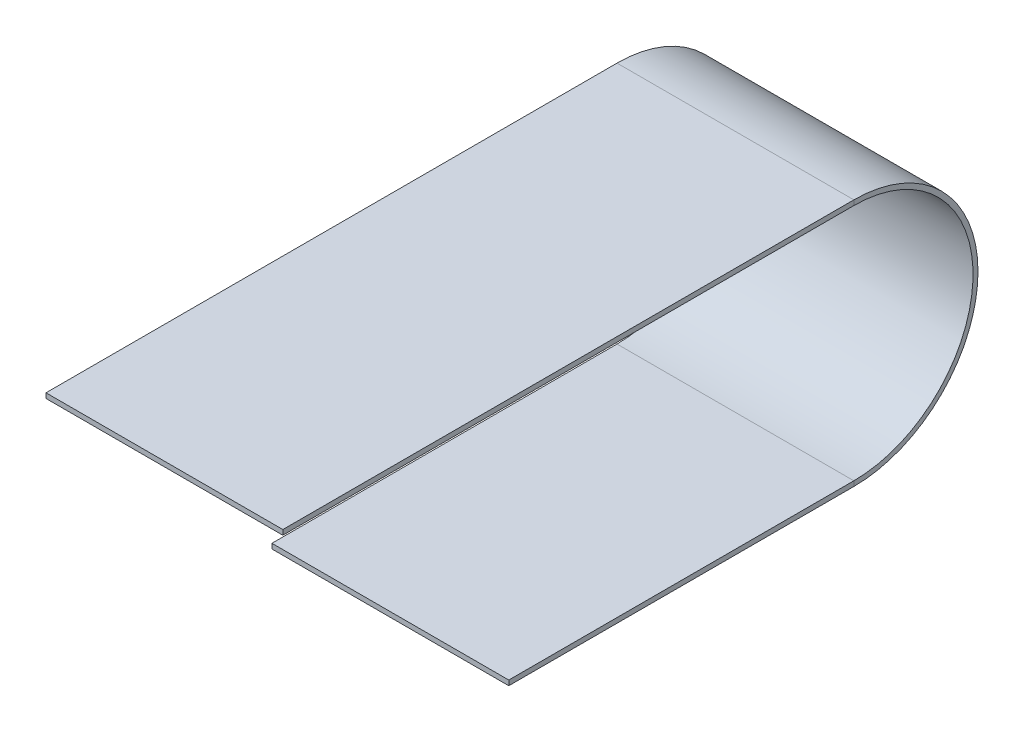
ISO-10303-21;
HEADER;
FILE_DESCRIPTION(('STEP AP214'),'2;1');
FILE_NAME('part.step','',(''),(''),'','','');
FILE_SCHEMA(('AUTOMOTIVE_DESIGN { 1 0 10303 214 1 1 1 1 }'));
ENDSEC;
DATA;
#1=APPLICATION_CONTEXT('core data for automotive mechanical design processes');
#2=APPLICATION_PROTOCOL_DEFINITION('international standard','automotive_design',2000,#1);
#3=PRODUCT_CONTEXT('',#1,'mechanical');
#4=PRODUCT('Part','Part','',(#3));
#5=PRODUCT_RELATED_PRODUCT_CATEGORY('part','',(#4));
#6=PRODUCT_DEFINITION_FORMATION('','',#4);
#7=PRODUCT_DEFINITION_CONTEXT('part definition',#1,'design');
#8=PRODUCT_DEFINITION('design','',#6,#7);
#9=PRODUCT_DEFINITION_SHAPE('','',#8);
#10=(LENGTH_UNIT() NAMED_UNIT(*) SI_UNIT(.MILLI.,.METRE.));
#11=(NAMED_UNIT(*) PLANE_ANGLE_UNIT() SI_UNIT($,.RADIAN.));
#12=(NAMED_UNIT(*) SI_UNIT($,.STERADIAN.) SOLID_ANGLE_UNIT());
#13=UNCERTAINTY_MEASURE_WITH_UNIT(LENGTH_MEASURE(1.E-05),#10,'distance_accuracy_value','');
#14=(GEOMETRIC_REPRESENTATION_CONTEXT(3) GLOBAL_UNCERTAINTY_ASSIGNED_CONTEXT((#13)) GLOBAL_UNIT_ASSIGNED_CONTEXT((#10,
#11,#12)) REPRESENTATION_CONTEXT('',''));
#15=CARTESIAN_POINT('',(0.,0.,0.));
#16=DIRECTION('',(0.,0.,1.));
#17=DIRECTION('',(1.,0.,0.));
#18=AXIS2_PLACEMENT_3D('',#15,#16,#17);
#19=CARTESIAN_POINT('',(0.,0.,-8.8));
#20=DIRECTION('',(0.,0.,-1.));
#21=DIRECTION('',(-1.,0.,0.));
#22=AXIS2_PLACEMENT_3D('',#19,#20,#21);
#23=PLANE('',#22);
#24=DIRECTION('',(0.,1.,0.));
#25=VECTOR('',#24,1.);
#26=CARTESIAN_POINT('',(15.23,-0.2,-8.8));
#27=LINE('',#26,#25);
#28=CARTESIAN_POINT('',(15.23,-0.2,-8.8));
#29=VERTEX_POINT('',#28);
#30=CARTESIAN_POINT('',(15.23,0.,-8.8));
#31=VERTEX_POINT('',#30);
#32=EDGE_CURVE('E114',#29,#31,#27,.T.);
#33=ORIENTED_EDGE('',*,*,#32,.F.);
#34=DIRECTION('',(-1.,0.,0.));
#35=VECTOR('',#34,1.);
#36=CARTESIAN_POINT('',(24.7699999999999,-0.2,-8.8));
#37=LINE('',#36,#35);
#38=CARTESIAN_POINT('',(24.7699999999999,-0.2,-8.8));
#39=VERTEX_POINT('',#38);
#40=EDGE_CURVE('E116',#39,#29,#37,.T.);
#41=ORIENTED_EDGE('',*,*,#40,.F.);
#42=DIRECTION('',(0.,-1.,0.));
#43=VECTOR('',#42,1.);
#44=CARTESIAN_POINT('',(24.7699999999999,0.,-8.8));
#45=LINE('',#44,#43);
#46=CARTESIAN_POINT('',(24.7699999999999,0.,-8.8));
#47=VERTEX_POINT('',#46);
#48=EDGE_CURVE('E133',#47,#39,#45,.T.);
#49=ORIENTED_EDGE('',*,*,#48,.F.);
#50=DIRECTION('',(1.,0.,0.));
#51=VECTOR('',#50,1.);
#52=CARTESIAN_POINT('',(15.23,0.,-8.8));
#53=LINE('',#52,#51);
#54=EDGE_CURVE('E119',#31,#47,#53,.T.);
#55=ORIENTED_EDGE('',*,*,#54,.F.);
#56=EDGE_LOOP('',(#33,#41,#49,#55));
#57=FACE_BOUND('',#56,.T.);
#58=ADVANCED_FACE('F30',(#57),#23,.F.);
#59=CARTESIAN_POINT('',(0.,-10.,-17.9));
#60=DIRECTION('',(0.,0.,1.));
#61=DIRECTION('',(-1.,0.,0.));
#62=AXIS2_PLACEMENT_3D('',#59,#60,#61);
#63=PLANE('',#62);
#64=DIRECTION('',(0.,-1.,0.));
#65=VECTOR('',#64,1.);
#66=CARTESIAN_POINT('',(15.23,-9.8,-17.9));
#67=LINE('',#66,#65);
#68=CARTESIAN_POINT('',(15.23,-9.8,-17.9));
#69=VERTEX_POINT('',#68);
#70=CARTESIAN_POINT('',(15.23,-10.,-17.9));
#71=VERTEX_POINT('',#70);
#72=EDGE_CURVE('E153',#69,#71,#67,.T.);
#73=ORIENTED_EDGE('',*,*,#72,.T.);
#74=DIRECTION('',(1.,0.,0.));
#75=VECTOR('',#74,1.);
#76=CARTESIAN_POINT('',(15.23,-10.,-17.9));
#77=LINE('',#76,#75);
#78=CARTESIAN_POINT('',(24.7699999999999,-10.,-17.9));
#79=VERTEX_POINT('',#78);
#80=EDGE_CURVE('E49',#71,#79,#77,.T.);
#81=ORIENTED_EDGE('',*,*,#80,.T.);
#82=DIRECTION('',(0.,1.,0.));
#83=VECTOR('',#82,1.);
#84=CARTESIAN_POINT('',(24.7699999999999,-10.,-17.9));
#85=LINE('',#84,#83);
#86=CARTESIAN_POINT('',(24.7699999999999,-9.8,-17.9));
#87=VERTEX_POINT('',#86);
#88=EDGE_CURVE('E43',#79,#87,#85,.T.);
#89=ORIENTED_EDGE('',*,*,#88,.T.);
#90=DIRECTION('',(-1.,0.,0.));
#91=VECTOR('',#90,1.);
#92=CARTESIAN_POINT('',(24.7699999999999,-9.8,-17.9));
#93=LINE('',#92,#91);
#94=EDGE_CURVE('E11',#87,#69,#93,.T.);
#95=ORIENTED_EDGE('',*,*,#94,.T.);
#96=EDGE_LOOP('',(#73,#81,#89,#95));
#97=FACE_BOUND('',#96,.T.);
#98=ADVANCED_FACE('F205',(#97),#63,.T.);
#99=CARTESIAN_POINT('',(15.23,-0.2,-8.8));
#100=DIRECTION('',(-1.,0.,0.));
#101=DIRECTION('',(0.,0.,1.));
#102=AXIS2_PLACEMENT_3D('',#99,#100,#101);
#103=PLANE('',#102);
#104=DIRECTION('',(0.,0.,-1.));
#105=VECTOR('',#104,1.);
#106=CARTESIAN_POINT('',(15.23,0.,-8.8));
#107=LINE('',#106,#105);
#108=CARTESIAN_POINT('',(15.23,0.,-31.8));
#109=VERTEX_POINT('',#108);
#110=EDGE_CURVE('E140',#31,#109,#107,.T.);
#111=ORIENTED_EDGE('',*,*,#110,.T.);
#112=DIRECTION('',(0.,1.,0.));
#113=VECTOR('',#112,1.);
#114=CARTESIAN_POINT('',(15.23,-0.2,-31.8));
#115=LINE('',#114,#113);
#116=CARTESIAN_POINT('',(15.23,-0.2,-31.8));
#117=VERTEX_POINT('',#116);
#118=EDGE_CURVE('E138',#117,#109,#115,.T.);
#119=ORIENTED_EDGE('',*,*,#118,.F.);
#120=DIRECTION('',(0.,0.,-1.));
#121=VECTOR('',#120,1.);
#122=CARTESIAN_POINT('',(15.23,-0.2,-8.8));
#123=LINE('',#122,#121);
#124=EDGE_CURVE('E130',#29,#117,#123,.T.);
#125=ORIENTED_EDGE('',*,*,#124,.F.);
#126=ORIENTED_EDGE('',*,*,#32,.T.);
#127=EDGE_LOOP('',(#111,#119,#125,#126));
#128=FACE_BOUND('',#127,.T.);
#129=ADVANCED_FACE('F136',(#128),#103,.T.);
#130=CARTESIAN_POINT('',(15.23,0.,-8.8));
#131=DIRECTION('',(0.,1.,0.));
#132=DIRECTION('',(0.,0.,1.));
#133=AXIS2_PLACEMENT_3D('',#130,#131,#132);
#134=PLANE('',#133);
#135=DIRECTION('',(0.,0.,-1.));
#136=VECTOR('',#135,1.);
#137=CARTESIAN_POINT('',(24.7699999999999,0.,-8.8));
#138=LINE('',#137,#136);
#139=CARTESIAN_POINT('',(24.7699999999999,0.,-31.8));
#140=VERTEX_POINT('',#139);
#141=EDGE_CURVE('E163',#47,#140,#138,.T.);
#142=ORIENTED_EDGE('',*,*,#141,.T.);
#143=DIRECTION('',(1.,0.,0.));
#144=VECTOR('',#143,1.);
#145=CARTESIAN_POINT('',(15.23,0.,-31.8));
#146=LINE('',#145,#144);
#147=EDGE_CURVE('E161',#109,#140,#146,.T.);
#148=ORIENTED_EDGE('',*,*,#147,.F.);
#149=ORIENTED_EDGE('',*,*,#110,.F.);
#150=ORIENTED_EDGE('',*,*,#54,.T.);
#151=EDGE_LOOP('',(#142,#148,#149,#150));
#152=FACE_BOUND('',#151,.T.);
#153=ADVANCED_FACE('F197',(#152),#134,.T.);
#154=CARTESIAN_POINT('',(24.7699999999999,0.,-8.8));
#155=DIRECTION('',(1.,0.,0.));
#156=DIRECTION('',(0.,0.,-1.));
#157=AXIS2_PLACEMENT_3D('',#154,#155,#156);
#158=PLANE('',#157);
#159=DIRECTION('',(0.,0.,-1.));
#160=VECTOR('',#159,1.);
#161=CARTESIAN_POINT('',(24.7699999999999,-0.2,-8.8));
#162=LINE('',#161,#160);
#163=CARTESIAN_POINT('',(24.7699999999999,-0.2,-31.8));
#164=VERTEX_POINT('',#163);
#165=EDGE_CURVE('E132',#39,#164,#162,.T.);
#166=ORIENTED_EDGE('',*,*,#165,.T.);
#167=DIRECTION('',(0.,-1.,0.));
#168=VECTOR('',#167,1.);
#169=CARTESIAN_POINT('',(24.7699999999999,0.,-31.8));
#170=LINE('',#169,#168);
#171=EDGE_CURVE('E166',#140,#164,#170,.T.);
#172=ORIENTED_EDGE('',*,*,#171,.F.);
#173=ORIENTED_EDGE('',*,*,#141,.F.);
#174=ORIENTED_EDGE('',*,*,#48,.T.);
#175=EDGE_LOOP('',(#166,#172,#173,#174));
#176=FACE_BOUND('',#175,.T.);
#177=ADVANCED_FACE('F190',(#176),#158,.T.);
#178=CARTESIAN_POINT('',(24.7699999999999,-0.2,-8.8));
#179=DIRECTION('',(0.,-1.,0.));
#180=DIRECTION('',(0.,0.,-1.));
#181=AXIS2_PLACEMENT_3D('',#178,#179,#180);
#182=PLANE('',#181);
#183=DIRECTION('',(-1.,0.,0.));
#184=VECTOR('',#183,1.);
#185=CARTESIAN_POINT('',(24.7699999999999,-0.2,-31.8));
#186=LINE('',#185,#184);
#187=EDGE_CURVE('E152',#164,#117,#186,.T.);
#188=ORIENTED_EDGE('',*,*,#187,.F.);
#189=ORIENTED_EDGE('',*,*,#165,.F.);
#190=ORIENTED_EDGE('',*,*,#40,.T.);
#191=ORIENTED_EDGE('',*,*,#124,.T.);
#192=EDGE_LOOP('',(#188,#189,#190,#191));
#193=FACE_BOUND('',#192,.T.);
#194=ADVANCED_FACE('F129',(#193),#182,.T.);
#195=CARTESIAN_POINT('',(15.23,-0.199999999999999,-31.8));
#196=DIRECTION('',(-1.,0.,0.));
#197=DIRECTION('',(0.,0.,1.));
#198=AXIS2_PLACEMENT_3D('',#195,#196,#197);
#199=PLANE('',#198);
#200=CARTESIAN_POINT('',(15.23,-5.,-31.8));
#201=DIRECTION('',(-1.,0.,0.));
#202=DIRECTION('',(0.,1.,0.));
#203=AXIS2_PLACEMENT_3D('',#200,#201,#202);
#204=CIRCLE('',#203,5.);
#205=CARTESIAN_POINT('',(15.23,-10.,-31.8));
#206=VERTEX_POINT('',#205);
#207=EDGE_CURVE('E103',#109,#206,#204,.T.);
#208=ORIENTED_EDGE('',*,*,#207,.T.);
#209=DIRECTION('',(0.,-1.,0.));
#210=VECTOR('',#209,1.);
#211=CARTESIAN_POINT('',(15.23,-9.8,-31.8));
#212=LINE('',#211,#210);
#213=CARTESIAN_POINT('',(15.23,-9.8,-31.8));
#214=VERTEX_POINT('',#213);
#215=EDGE_CURVE('E144',#214,#206,#212,.T.);
#216=ORIENTED_EDGE('',*,*,#215,.F.);
#217=CARTESIAN_POINT('',(15.23,-5.,-31.8));
#218=DIRECTION('',(-1.,0.,0.));
#219=DIRECTION('',(0.,1.,0.));
#220=AXIS2_PLACEMENT_3D('',#217,#218,#219);
#221=CIRCLE('',#220,4.8);
#222=EDGE_CURVE('E147',#117,#214,#221,.T.);
#223=ORIENTED_EDGE('',*,*,#222,.F.);
#224=ORIENTED_EDGE('',*,*,#118,.T.);
#225=EDGE_LOOP('',(#208,#216,#223,#224));
#226=FACE_BOUND('',#225,.T.);
#227=ADVANCED_FACE('F186',(#226),#199,.T.);
#228=CARTESIAN_POINT('',(20.,-5.,-31.8));
#229=DIRECTION('',(-1.,0.,0.));
#230=DIRECTION('',(0.,0.,1.));
#231=AXIS2_PLACEMENT_3D('',#228,#229,#230);
#232=CYLINDRICAL_SURFACE('',#231,5.);
#233=CARTESIAN_POINT('',(24.7699999999999,-5.,-31.8));
#234=DIRECTION('',(-1.,0.,0.));
#235=DIRECTION('',(0.,1.,0.));
#236=AXIS2_PLACEMENT_3D('',#233,#234,#235);
#237=CIRCLE('',#236,5.);
#238=CARTESIAN_POINT('',(24.7699999999999,-10.,-31.8));
#239=VERTEX_POINT('',#238);
#240=EDGE_CURVE('E97',#140,#239,#237,.T.);
#241=ORIENTED_EDGE('',*,*,#240,.T.);
#242=DIRECTION('',(1.,0.,0.));
#243=VECTOR('',#242,1.);
#244=CARTESIAN_POINT('',(15.23,-10.,-31.8));
#245=LINE('',#244,#243);
#246=EDGE_CURVE('E149',#206,#239,#245,.T.);
#247=ORIENTED_EDGE('',*,*,#246,.F.);
#248=ORIENTED_EDGE('',*,*,#207,.F.);
#249=ORIENTED_EDGE('',*,*,#147,.T.);
#250=EDGE_LOOP('',(#241,#247,#248,#249));
#251=FACE_BOUND('',#250,.T.);
#252=ADVANCED_FACE('F195',(#251),#232,.T.);
#253=CARTESIAN_POINT('',(24.7699999999999,0.,-31.8));
#254=DIRECTION('',(1.,0.,0.));
#255=DIRECTION('',(0.,0.,-1.));
#256=AXIS2_PLACEMENT_3D('',#253,#254,#255);
#257=PLANE('',#256);
#258=CARTESIAN_POINT('',(24.7699999999999,-5.,-31.8));
#259=DIRECTION('',(-1.,0.,0.));
#260=DIRECTION('',(0.,1.,0.));
#261=AXIS2_PLACEMENT_3D('',#258,#259,#260);
#262=CIRCLE('',#261,4.8);
#263=CARTESIAN_POINT('',(24.7699999999999,-9.8,-31.8));
#264=VERTEX_POINT('',#263);
#265=EDGE_CURVE('E176',#164,#264,#262,.T.);
#266=ORIENTED_EDGE('',*,*,#265,.T.);
#267=DIRECTION('',(0.,1.,0.));
#268=VECTOR('',#267,1.);
#269=CARTESIAN_POINT('',(24.7699999999999,-10.,-31.8));
#270=LINE('',#269,#268);
#271=EDGE_CURVE('E169',#239,#264,#270,.T.);
#272=ORIENTED_EDGE('',*,*,#271,.F.);
#273=ORIENTED_EDGE('',*,*,#240,.F.);
#274=ORIENTED_EDGE('',*,*,#171,.T.);
#275=EDGE_LOOP('',(#266,#272,#273,#274));
#276=FACE_BOUND('',#275,.T.);
#277=ADVANCED_FACE('F192',(#276),#257,.T.);
#278=CARTESIAN_POINT('',(20.,-5.,-31.8));
#279=DIRECTION('',(-1.,0.,0.));
#280=DIRECTION('',(0.,0.,1.));
#281=AXIS2_PLACEMENT_3D('',#278,#279,#280);
#282=CYLINDRICAL_SURFACE('',#281,4.8);
#283=DIRECTION('',(-1.,0.,0.));
#284=VECTOR('',#283,1.);
#285=CARTESIAN_POINT('',(24.7699999999999,-9.8,-31.8));
#286=LINE('',#285,#284);
#287=EDGE_CURVE('E159',#264,#214,#286,.T.);
#288=ORIENTED_EDGE('',*,*,#287,.F.);
#289=ORIENTED_EDGE('',*,*,#265,.F.);
#290=ORIENTED_EDGE('',*,*,#187,.T.);
#291=ORIENTED_EDGE('',*,*,#222,.T.);
#292=EDGE_LOOP('',(#288,#289,#290,#291));
#293=FACE_BOUND('',#292,.T.);
#294=ADVANCED_FACE('F188',(#293),#282,.F.);
#295=CARTESIAN_POINT('',(15.23,-9.8,-31.8));
#296=DIRECTION('',(-1.,0.,0.));
#297=DIRECTION('',(0.,0.,1.));
#298=AXIS2_PLACEMENT_3D('',#295,#296,#297);
#299=PLANE('',#298);
#300=DIRECTION('',(0.,0.,1.));
#301=VECTOR('',#300,1.);
#302=CARTESIAN_POINT('',(15.23,-10.,-31.8));
#303=LINE('',#302,#301);
#304=EDGE_CURVE('E84',#206,#71,#303,.T.);
#305=ORIENTED_EDGE('',*,*,#304,.T.);
#306=ORIENTED_EDGE('',*,*,#72,.F.);
#307=DIRECTION('',(0.,0.,1.));
#308=VECTOR('',#307,1.);
#309=CARTESIAN_POINT('',(15.23,-9.8,-31.8));
#310=LINE('',#309,#308);
#311=EDGE_CURVE('E155',#214,#69,#310,.T.);
#312=ORIENTED_EDGE('',*,*,#311,.F.);
#313=ORIENTED_EDGE('',*,*,#215,.T.);
#314=EDGE_LOOP('',(#305,#306,#312,#313));
#315=FACE_BOUND('',#314,.T.);
#316=ADVANCED_FACE('F222',(#315),#299,.T.);
#317=CARTESIAN_POINT('',(15.23,-10.,-31.8));
#318=DIRECTION('',(0.,-1.,0.));
#319=DIRECTION('',(0.,0.,-1.));
#320=AXIS2_PLACEMENT_3D('',#317,#318,#319);
#321=PLANE('',#320);
#322=DIRECTION('',(0.,0.,1.));
#323=VECTOR('',#322,1.);
#324=CARTESIAN_POINT('',(24.7699999999999,-10.,-31.8));
#325=LINE('',#324,#323);
#326=EDGE_CURVE('E77',#239,#79,#325,.T.);
#327=ORIENTED_EDGE('',*,*,#326,.T.);
#328=ORIENTED_EDGE('',*,*,#80,.F.);
#329=ORIENTED_EDGE('',*,*,#304,.F.);
#330=ORIENTED_EDGE('',*,*,#246,.T.);
#331=EDGE_LOOP('',(#327,#328,#329,#330));
#332=FACE_BOUND('',#331,.T.);
#333=ADVANCED_FACE('F194',(#332),#321,.T.);
#334=CARTESIAN_POINT('',(24.7699999999999,-10.,-31.8));
#335=DIRECTION('',(1.,0.,0.));
#336=DIRECTION('',(0.,0.,-1.));
#337=AXIS2_PLACEMENT_3D('',#334,#335,#336);
#338=PLANE('',#337);
#339=DIRECTION('',(0.,0.,1.));
#340=VECTOR('',#339,1.);
#341=CARTESIAN_POINT('',(24.7699999999999,-9.8,-31.8));
#342=LINE('',#341,#340);
#343=EDGE_CURVE('E37',#264,#87,#342,.T.);
#344=ORIENTED_EDGE('',*,*,#343,.T.);
#345=ORIENTED_EDGE('',*,*,#88,.F.);
#346=ORIENTED_EDGE('',*,*,#326,.F.);
#347=ORIENTED_EDGE('',*,*,#271,.T.);
#348=EDGE_LOOP('',(#344,#345,#346,#347));
#349=FACE_BOUND('',#348,.T.);
#350=ADVANCED_FACE('F193',(#349),#338,.T.);
#351=CARTESIAN_POINT('',(24.7699999999999,-9.8,-31.8));
#352=DIRECTION('',(0.,1.,0.));
#353=DIRECTION('',(0.,0.,1.));
#354=AXIS2_PLACEMENT_3D('',#351,#352,#353);
#355=PLANE('',#354);
#356=ORIENTED_EDGE('',*,*,#94,.F.);
#357=ORIENTED_EDGE('',*,*,#343,.F.);
#358=ORIENTED_EDGE('',*,*,#287,.T.);
#359=ORIENTED_EDGE('',*,*,#311,.T.);
#360=EDGE_LOOP('',(#356,#357,#358,#359));
#361=FACE_BOUND('',#360,.T.);
#362=ADVANCED_FACE('F183',(#361),#355,.T.);
#363=CLOSED_SHELL('',(#58,#98,#129,#153,#177,#194,#227,#252,#277,#294,#316,#333,#350,#362));
#364=MANIFOLD_SOLID_BREP('B2',#363);
#365=ADVANCED_BREP_SHAPE_REPRESENTATION('',(#18,#364),#14);
#366=SHAPE_DEFINITION_REPRESENTATION(#9,#365);
ENDSEC;
END-ISO-10303-21;
